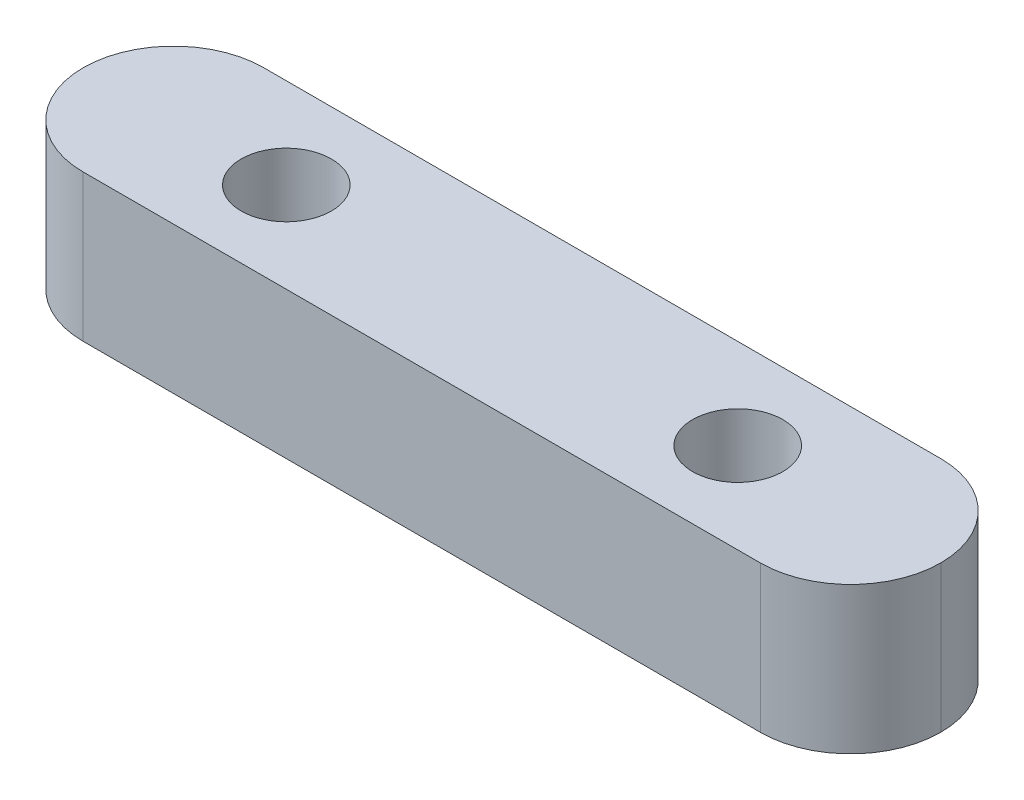
ISO-10303-21;
HEADER;
FILE_DESCRIPTION(('STEP AP214'),'2;1');
FILE_NAME('part.step','',(''),(''),'','','');
FILE_SCHEMA(('AUTOMOTIVE_DESIGN { 1 0 10303 214 1 1 1 1 }'));
ENDSEC;
DATA;
#1=APPLICATION_CONTEXT('core data for automotive mechanical design processes');
#2=APPLICATION_PROTOCOL_DEFINITION('international standard','automotive_design',2000,#1);
#3=PRODUCT_CONTEXT('',#1,'mechanical');
#4=PRODUCT('Part','Part','',(#3));
#5=PRODUCT_RELATED_PRODUCT_CATEGORY('part','',(#4));
#6=PRODUCT_DEFINITION_FORMATION('','',#4);
#7=PRODUCT_DEFINITION_CONTEXT('part definition',#1,'design');
#8=PRODUCT_DEFINITION('design','',#6,#7);
#9=PRODUCT_DEFINITION_SHAPE('','',#8);
#10=(LENGTH_UNIT() NAMED_UNIT(*) SI_UNIT(.MILLI.,.METRE.));
#11=(NAMED_UNIT(*) PLANE_ANGLE_UNIT() SI_UNIT($,.RADIAN.));
#12=(NAMED_UNIT(*) SI_UNIT($,.STERADIAN.) SOLID_ANGLE_UNIT());
#13=UNCERTAINTY_MEASURE_WITH_UNIT(LENGTH_MEASURE(1.E-05),#10,'distance_accuracy_value','');
#14=(GEOMETRIC_REPRESENTATION_CONTEXT(3) GLOBAL_UNCERTAINTY_ASSIGNED_CONTEXT((#13)) GLOBAL_UNIT_ASSIGNED_CONTEXT((#10,
#11,#12)) REPRESENTATION_CONTEXT('',''));
#15=CARTESIAN_POINT('',(0.,0.,0.));
#16=DIRECTION('',(0.,0.,1.));
#17=DIRECTION('',(1.,0.,0.));
#18=AXIS2_PLACEMENT_3D('',#15,#16,#17);
#19=CARTESIAN_POINT('',(0.,3.25,0.));
#20=DIRECTION('',(0.,-1.,0.));
#21=DIRECTION('',(0.,0.,-1.));
#22=AXIS2_PLACEMENT_3D('',#19,#20,#21);
#23=PLANE('',#22);
#24=CARTESIAN_POINT('',(-15.,3.25,0.));
#25=DIRECTION('',(0.,-1.,0.));
#26=DIRECTION('',(0.,0.,-1.));
#27=AXIS2_PLACEMENT_3D('',#24,#25,#26);
#28=CIRCLE('',#27,4.);
#29=CARTESIAN_POINT('',(-15.,3.25,-4.));
#30=VERTEX_POINT('',#29);
#31=CARTESIAN_POINT('',(-19.,3.25,0.));
#32=VERTEX_POINT('',#31);
#33=EDGE_CURVE('E59',#30,#32,#28,.F.);
#34=ORIENTED_EDGE('',*,*,#33,.T.);
#35=CARTESIAN_POINT('',(-15.,3.25,0.));
#36=DIRECTION('',(0.,-1.,0.));
#37=DIRECTION('',(0.,0.,-1.));
#38=AXIS2_PLACEMENT_3D('',#35,#36,#37);
#39=CIRCLE('',#38,4.);
#40=CARTESIAN_POINT('',(-15.,3.25,4.));
#41=VERTEX_POINT('',#40);
#42=EDGE_CURVE('E140',#32,#41,#39,.F.);
#43=ORIENTED_EDGE('',*,*,#42,.T.);
#44=DIRECTION('',(1.,0.,0.));
#45=VECTOR('',#44,1.);
#46=CARTESIAN_POINT('',(-19.,3.25,4.));
#47=LINE('',#46,#45);
#48=CARTESIAN_POINT('',(15.,3.25,4.));
#49=VERTEX_POINT('',#48);
#50=EDGE_CURVE('E113',#41,#49,#47,.T.);
#51=ORIENTED_EDGE('',*,*,#50,.T.);
#52=CARTESIAN_POINT('',(15.,3.25,0.));
#53=DIRECTION('',(0.,-1.,0.));
#54=DIRECTION('',(0.,0.,-1.));
#55=AXIS2_PLACEMENT_3D('',#52,#53,#54);
#56=CIRCLE('',#55,4.);
#57=CARTESIAN_POINT('',(19.,3.25,0.));
#58=VERTEX_POINT('',#57);
#59=EDGE_CURVE('E104',#49,#58,#56,.F.);
#60=ORIENTED_EDGE('',*,*,#59,.T.);
#61=CARTESIAN_POINT('',(15.,3.25,0.));
#62=DIRECTION('',(0.,-1.,0.));
#63=DIRECTION('',(0.,0.,-1.));
#64=AXIS2_PLACEMENT_3D('',#61,#62,#63);
#65=CIRCLE('',#64,4.);
#66=CARTESIAN_POINT('',(15.,3.25,-4.));
#67=VERTEX_POINT('',#66);
#68=EDGE_CURVE('E138',#58,#67,#65,.F.);
#69=ORIENTED_EDGE('',*,*,#68,.T.);
#70=DIRECTION('',(-1.,0.,0.));
#71=VECTOR('',#70,1.);
#72=CARTESIAN_POINT('',(-19.,3.25,-4.));
#73=LINE('',#72,#71);
#74=EDGE_CURVE('E125',#67,#30,#73,.T.);
#75=ORIENTED_EDGE('',*,*,#74,.T.);
#76=EDGE_LOOP('',(#34,#43,#51,#60,#69,#75));
#77=FACE_BOUND('',#76,.T.);
#78=CARTESIAN_POINT('',(-10.,3.25,0.));
#79=DIRECTION('',(0.,1.,0.));
#80=DIRECTION('',(0.,0.,1.));
#81=AXIS2_PLACEMENT_3D('',#78,#79,#80);
#82=CIRCLE('',#81,2.);
#83=CARTESIAN_POINT('',(-10.,3.25,-2.));
#84=VERTEX_POINT('',#83);
#85=EDGE_CURVE('E127',#84,#84,#82,.T.);
#86=ORIENTED_EDGE('',*,*,#85,.F.);
#87=EDGE_LOOP('',(#86));
#88=FACE_BOUND('',#87,.T.);
#89=CARTESIAN_POINT('',(10.,3.25,0.));
#90=DIRECTION('',(0.,1.,0.));
#91=DIRECTION('',(0.,0.,-1.));
#92=AXIS2_PLACEMENT_3D('',#89,#90,#91);
#93=CIRCLE('',#92,2.);
#94=CARTESIAN_POINT('',(10.,3.25,-2.));
#95=VERTEX_POINT('',#94);
#96=EDGE_CURVE('E145',#95,#95,#93,.T.);
#97=ORIENTED_EDGE('',*,*,#96,.F.);
#98=EDGE_LOOP('',(#97));
#99=FACE_BOUND('',#98,.T.);
#100=ADVANCED_FACE('F41',(#77,#88,#99),#23,.F.);
#101=CARTESIAN_POINT('',(0.,-3.25,0.));
#102=DIRECTION('',(0.,-1.,0.));
#103=DIRECTION('',(0.,0.,-1.));
#104=AXIS2_PLACEMENT_3D('',#101,#102,#103);
#105=PLANE('',#104);
#106=CARTESIAN_POINT('',(-10.,-3.25,0.));
#107=DIRECTION('',(0.,1.,0.));
#108=DIRECTION('',(0.,0.,1.));
#109=AXIS2_PLACEMENT_3D('',#106,#107,#108);
#110=CIRCLE('',#109,2.);
#111=CARTESIAN_POINT('',(-10.,-3.25,-2.));
#112=VERTEX_POINT('',#111);
#113=EDGE_CURVE('E156',#112,#112,#110,.T.);
#114=ORIENTED_EDGE('',*,*,#113,.T.);
#115=EDGE_LOOP('',(#114));
#116=FACE_BOUND('',#115,.T.);
#117=DIRECTION('',(1.,0.,0.));
#118=VECTOR('',#117,1.);
#119=CARTESIAN_POINT('',(-19.,-3.25,4.));
#120=LINE('',#119,#118);
#121=CARTESIAN_POINT('',(-15.,-3.25,4.));
#122=VERTEX_POINT('',#121);
#123=CARTESIAN_POINT('',(15.,-3.25,4.));
#124=VERTEX_POINT('',#123);
#125=EDGE_CURVE('E115',#122,#124,#120,.T.);
#126=ORIENTED_EDGE('',*,*,#125,.F.);
#127=CARTESIAN_POINT('',(-15.,-3.25,0.));
#128=DIRECTION('',(0.,-1.,0.));
#129=DIRECTION('',(0.,0.,-1.));
#130=AXIS2_PLACEMENT_3D('',#127,#128,#129);
#131=CIRCLE('',#130,4.);
#132=CARTESIAN_POINT('',(-19.,-3.25,0.));
#133=VERTEX_POINT('',#132);
#134=EDGE_CURVE('E96',#122,#133,#131,.T.);
#135=ORIENTED_EDGE('',*,*,#134,.T.);
#136=CARTESIAN_POINT('',(-15.,-3.25,0.));
#137=DIRECTION('',(0.,-1.,0.));
#138=DIRECTION('',(0.,0.,-1.));
#139=AXIS2_PLACEMENT_3D('',#136,#137,#138);
#140=CIRCLE('',#139,4.);
#141=CARTESIAN_POINT('',(-15.,-3.25,-4.));
#142=VERTEX_POINT('',#141);
#143=EDGE_CURVE('E106',#133,#142,#140,.T.);
#144=ORIENTED_EDGE('',*,*,#143,.T.);
#145=DIRECTION('',(-1.,0.,0.));
#146=VECTOR('',#145,1.);
#147=CARTESIAN_POINT('',(-19.,-3.25,-4.));
#148=LINE('',#147,#146);
#149=CARTESIAN_POINT('',(15.,-3.25,-4.));
#150=VERTEX_POINT('',#149);
#151=EDGE_CURVE('E123',#150,#142,#148,.T.);
#152=ORIENTED_EDGE('',*,*,#151,.F.);
#153=CARTESIAN_POINT('',(15.,-3.25,0.));
#154=DIRECTION('',(0.,-1.,0.));
#155=DIRECTION('',(0.,0.,-1.));
#156=AXIS2_PLACEMENT_3D('',#153,#154,#155);
#157=CIRCLE('',#156,4.);
#158=CARTESIAN_POINT('',(19.,-3.25,0.));
#159=VERTEX_POINT('',#158);
#160=EDGE_CURVE('E131',#150,#159,#157,.T.);
#161=ORIENTED_EDGE('',*,*,#160,.T.);
#162=CARTESIAN_POINT('',(15.,-3.25,0.));
#163=DIRECTION('',(0.,-1.,0.));
#164=DIRECTION('',(0.,0.,-1.));
#165=AXIS2_PLACEMENT_3D('',#162,#163,#164);
#166=CIRCLE('',#165,4.);
#167=EDGE_CURVE('E119',#159,#124,#166,.T.);
#168=ORIENTED_EDGE('',*,*,#167,.T.);
#169=EDGE_LOOP('',(#126,#135,#144,#152,#161,#168));
#170=FACE_BOUND('',#169,.T.);
#171=CARTESIAN_POINT('',(10.,-3.25,0.));
#172=DIRECTION('',(0.,1.,0.));
#173=DIRECTION('',(0.,0.,-1.));
#174=AXIS2_PLACEMENT_3D('',#171,#172,#173);
#175=CIRCLE('',#174,2.);
#176=CARTESIAN_POINT('',(10.,-3.25,-2.));
#177=VERTEX_POINT('',#176);
#178=EDGE_CURVE('E142',#177,#177,#175,.T.);
#179=ORIENTED_EDGE('',*,*,#178,.T.);
#180=EDGE_LOOP('',(#179));
#181=FACE_BOUND('',#180,.T.);
#182=ADVANCED_FACE('F118',(#116,#170,#181),#105,.T.);
#183=CARTESIAN_POINT('',(-19.,3.25,-4.));
#184=DIRECTION('',(0.,0.,1.));
#185=DIRECTION('',(1.,0.,0.));
#186=AXIS2_PLACEMENT_3D('',#183,#184,#185);
#187=PLANE('',#186);
#188=ORIENTED_EDGE('',*,*,#151,.T.);
#189=DIRECTION('',(0.,-1.,0.));
#190=VECTOR('',#189,1.);
#191=CARTESIAN_POINT('',(-15.,3.25,-4.));
#192=LINE('',#191,#190);
#193=EDGE_CURVE('E11',#142,#30,#192,.F.);
#194=ORIENTED_EDGE('',*,*,#193,.T.);
#195=ORIENTED_EDGE('',*,*,#74,.F.);
#196=DIRECTION('',(0.,-1.,0.));
#197=VECTOR('',#196,1.);
#198=CARTESIAN_POINT('',(15.,3.25,-4.));
#199=LINE('',#198,#197);
#200=EDGE_CURVE('E49',#67,#150,#199,.T.);
#201=ORIENTED_EDGE('',*,*,#200,.T.);
#202=EDGE_LOOP('',(#188,#194,#195,#201));
#203=FACE_BOUND('',#202,.T.);
#204=ADVANCED_FACE('F175',(#203),#187,.F.);
#205=CARTESIAN_POINT('',(-19.,3.25,4.));
#206=DIRECTION('',(0.,0.,-1.));
#207=DIRECTION('',(-1.,0.,0.));
#208=AXIS2_PLACEMENT_3D('',#205,#206,#207);
#209=PLANE('',#208);
#210=ORIENTED_EDGE('',*,*,#50,.F.);
#211=DIRECTION('',(0.,-1.,0.));
#212=VECTOR('',#211,1.);
#213=CARTESIAN_POINT('',(-15.,3.25,4.));
#214=LINE('',#213,#212);
#215=EDGE_CURVE('E99',#41,#122,#214,.T.);
#216=ORIENTED_EDGE('',*,*,#215,.T.);
#217=ORIENTED_EDGE('',*,*,#125,.T.);
#218=DIRECTION('',(0.,-1.,0.));
#219=VECTOR('',#218,1.);
#220=CARTESIAN_POINT('',(15.,3.25,4.));
#221=LINE('',#220,#219);
#222=EDGE_CURVE('E116',#124,#49,#221,.F.);
#223=ORIENTED_EDGE('',*,*,#222,.T.);
#224=EDGE_LOOP('',(#210,#216,#217,#223));
#225=FACE_BOUND('',#224,.T.);
#226=ADVANCED_FACE('F112',(#225),#209,.F.);
#227=CARTESIAN_POINT('',(-10.,3.25,0.));
#228=DIRECTION('',(0.,-1.,0.));
#229=DIRECTION('',(0.,0.,-1.));
#230=AXIS2_PLACEMENT_3D('',#227,#228,#229);
#231=CYLINDRICAL_SURFACE('',#230,2.);
#232=CARTESIAN_POINT('',(-10.,3.25,-2.));
#233=CARTESIAN_POINT('',(-10.,3.18229166666667,-2.));
#234=CARTESIAN_POINT('',(-10.,3.11458333333333,-2.));
#235=CARTESIAN_POINT('',(-10.,2.97916666666667,-2.));
#236=CARTESIAN_POINT('',(-10.,2.91145833333333,-2.));
#237=CARTESIAN_POINT('',(-10.,2.77604166666667,-2.));
#238=CARTESIAN_POINT('',(-10.,2.70833333333333,-2.));
#239=CARTESIAN_POINT('',(-10.,2.57291666666667,-2.));
#240=CARTESIAN_POINT('',(-10.,2.50520833333333,-2.));
#241=CARTESIAN_POINT('',(-10.,2.36979166666667,-2.));
#242=CARTESIAN_POINT('',(-10.,2.30208333333333,-2.));
#243=CARTESIAN_POINT('',(-10.,2.16666666666667,-2.));
#244=CARTESIAN_POINT('',(-10.,2.09895833333333,-2.));
#245=CARTESIAN_POINT('',(-10.,1.96354166666667,-2.));
#246=CARTESIAN_POINT('',(-10.,1.89583333333333,-2.));
#247=CARTESIAN_POINT('',(-10.,1.76041666666667,-2.));
#248=CARTESIAN_POINT('',(-10.,1.69270833333333,-2.));
#249=CARTESIAN_POINT('',(-10.,1.55729166666667,-2.));
#250=CARTESIAN_POINT('',(-10.,1.48958333333333,-2.));
#251=CARTESIAN_POINT('',(-10.,1.35416666666667,-2.));
#252=CARTESIAN_POINT('',(-10.,1.28645833333333,-2.));
#253=CARTESIAN_POINT('',(-10.,1.15104166666667,-2.));
#254=CARTESIAN_POINT('',(-10.,1.08333333333333,-2.));
#255=CARTESIAN_POINT('',(-10.,0.947916666666666,-2.));
#256=CARTESIAN_POINT('',(-10.,0.880208333333333,-2.));
#257=CARTESIAN_POINT('',(-10.,0.744791666666666,-2.));
#258=CARTESIAN_POINT('',(-10.,0.677083333333333,-2.));
#259=CARTESIAN_POINT('',(-10.,0.541666666666666,-2.));
#260=CARTESIAN_POINT('',(-10.,0.473958333333333,-2.));
#261=CARTESIAN_POINT('',(-10.,0.338541666666666,-2.));
#262=CARTESIAN_POINT('',(-10.,0.270833333333333,-2.));
#263=CARTESIAN_POINT('',(-10.,0.135416666666666,-2.));
#264=CARTESIAN_POINT('',(-10.,0.0677083333333329,-2.));
#265=CARTESIAN_POINT('',(-10.,-0.0677083333333338,-2.));
#266=CARTESIAN_POINT('',(-10.,-0.135416666666667,-2.));
#267=CARTESIAN_POINT('',(-10.,-0.270833333333334,-2.));
#268=CARTESIAN_POINT('',(-10.,-0.338541666666667,-2.));
#269=CARTESIAN_POINT('',(-10.,-0.473958333333334,-2.));
#270=CARTESIAN_POINT('',(-10.,-0.541666666666667,-2.));
#271=CARTESIAN_POINT('',(-10.,-0.677083333333333,-2.));
#272=CARTESIAN_POINT('',(-10.,-0.744791666666667,-2.));
#273=CARTESIAN_POINT('',(-10.,-0.880208333333333,-2.));
#274=CARTESIAN_POINT('',(-10.,-0.947916666666666,-2.));
#275=CARTESIAN_POINT('',(-10.,-1.08333333333333,-2.));
#276=CARTESIAN_POINT('',(-10.,-1.15104166666667,-2.));
#277=CARTESIAN_POINT('',(-10.,-1.28645833333333,-2.));
#278=CARTESIAN_POINT('',(-10.,-1.35416666666667,-2.));
#279=CARTESIAN_POINT('',(-10.,-1.48958333333333,-2.));
#280=CARTESIAN_POINT('',(-10.,-1.55729166666667,-2.));
#281=CARTESIAN_POINT('',(-10.,-1.69270833333333,-2.));
#282=CARTESIAN_POINT('',(-10.,-1.76041666666667,-2.));
#283=CARTESIAN_POINT('',(-10.,-1.89583333333333,-2.));
#284=CARTESIAN_POINT('',(-10.,-1.96354166666667,-2.));
#285=CARTESIAN_POINT('',(-10.,-2.09895833333333,-2.));
#286=CARTESIAN_POINT('',(-10.,-2.16666666666667,-2.));
#287=CARTESIAN_POINT('',(-10.,-2.30208333333333,-2.));
#288=CARTESIAN_POINT('',(-10.,-2.36979166666667,-2.));
#289=CARTESIAN_POINT('',(-10.,-2.50520833333333,-2.));
#290=CARTESIAN_POINT('',(-10.,-2.57291666666667,-2.));
#291=CARTESIAN_POINT('',(-10.,-2.70833333333333,-2.));
#292=CARTESIAN_POINT('',(-10.,-2.77604166666667,-2.));
#293=CARTESIAN_POINT('',(-10.,-2.91145833333333,-2.));
#294=CARTESIAN_POINT('',(-10.,-2.97916666666667,-2.));
#295=CARTESIAN_POINT('',(-10.,-3.11458333333333,-2.));
#296=CARTESIAN_POINT('',(-10.,-3.18229166666667,-2.));
#297=CARTESIAN_POINT('',(-10.,-3.25,-2.));
#298=B_SPLINE_CURVE_WITH_KNOTS('',3,(#232,#233,#234,#235,#236,#237,#238,#239,#240,#241,#242,
#243,#244,#245,#246,#247,#248,#249,#250,#251,#252,#253,#254,#255,#256,#257,#258,#259,#260,#261,
#262,#263,#264,#265,#266,#267,#268,#269,#270,#271,#272,#273,#274,#275,#276,#277,#278,#279,#280,
#281,#282,#283,#284,#285,#286,#287,#288,#289,#290,#291,#292,#293,#294,#295,#296,#297),
.UNSPECIFIED.,.F.,.F.,(4,2,2,2,2,2,2,2,2,2,2,2,2,2,2,2,2,2,2,2,2,2,2,2,2,2,2,2,2,2,2,2,4),(0.,
0.203125,0.40625,0.609375,0.8125,1.015625,1.21875,1.421875,1.625,1.828125,2.03125,2.234375,
2.4375,2.640625,2.84375,3.046875,3.25,3.453125,3.65625,3.859375,4.0625,4.265625,4.46875,
4.671875,4.875,5.078125,5.28125,5.484375,5.6875,5.890625,6.09375,6.296875,6.5),.UNSPECIFIED.);
#299=EDGE_CURVE('BSEAM180',#84,#112,#298,.T.);
#300=ORIENTED_EDGE('',*,*,#85,.T.);
#301=ORIENTED_EDGE('',*,*,#113,.F.);
#302=ORIENTED_EDGE('',*,*,#299,.T.);
#303=ORIENTED_EDGE('',*,*,#299,.F.);
#304=EDGE_LOOP('',(#300,#302,#301,#303));
#305=FACE_BOUND('',#304,.T.);
#306=ADVANCED_FACE('F180',(#305),#231,.F.);
#307=CARTESIAN_POINT('',(10.,3.25,0.));
#308=DIRECTION('',(0.,-1.,0.));
#309=DIRECTION('',(0.,0.,-1.));
#310=AXIS2_PLACEMENT_3D('',#307,#308,#309);
#311=CYLINDRICAL_SURFACE('',#310,2.);
#312=CARTESIAN_POINT('',(10.,3.25,-2.));
#313=CARTESIAN_POINT('',(10.,3.18229166666667,-2.));
#314=CARTESIAN_POINT('',(10.,3.11458333333333,-2.));
#315=CARTESIAN_POINT('',(10.,2.97916666666667,-2.));
#316=CARTESIAN_POINT('',(10.,2.91145833333333,-2.));
#317=CARTESIAN_POINT('',(10.,2.77604166666667,-2.));
#318=CARTESIAN_POINT('',(10.,2.70833333333333,-2.));
#319=CARTESIAN_POINT('',(10.,2.57291666666667,-2.));
#320=CARTESIAN_POINT('',(10.,2.50520833333333,-2.));
#321=CARTESIAN_POINT('',(10.,2.36979166666667,-2.));
#322=CARTESIAN_POINT('',(10.,2.30208333333333,-2.));
#323=CARTESIAN_POINT('',(10.,2.16666666666667,-2.));
#324=CARTESIAN_POINT('',(10.,2.09895833333333,-2.));
#325=CARTESIAN_POINT('',(10.,1.96354166666667,-2.));
#326=CARTESIAN_POINT('',(10.,1.89583333333333,-2.));
#327=CARTESIAN_POINT('',(10.,1.76041666666667,-2.));
#328=CARTESIAN_POINT('',(10.,1.69270833333333,-2.));
#329=CARTESIAN_POINT('',(10.,1.55729166666667,-2.));
#330=CARTESIAN_POINT('',(10.,1.48958333333333,-2.));
#331=CARTESIAN_POINT('',(10.,1.35416666666667,-2.));
#332=CARTESIAN_POINT('',(10.,1.28645833333333,-2.));
#333=CARTESIAN_POINT('',(10.,1.15104166666667,-2.));
#334=CARTESIAN_POINT('',(10.,1.08333333333333,-2.));
#335=CARTESIAN_POINT('',(10.,0.947916666666666,-2.));
#336=CARTESIAN_POINT('',(10.,0.880208333333333,-2.));
#337=CARTESIAN_POINT('',(10.,0.744791666666666,-2.));
#338=CARTESIAN_POINT('',(10.,0.677083333333333,-2.));
#339=CARTESIAN_POINT('',(10.,0.541666666666666,-2.));
#340=CARTESIAN_POINT('',(10.,0.473958333333333,-2.));
#341=CARTESIAN_POINT('',(10.,0.338541666666666,-2.));
#342=CARTESIAN_POINT('',(10.,0.270833333333333,-2.));
#343=CARTESIAN_POINT('',(10.,0.135416666666666,-2.));
#344=CARTESIAN_POINT('',(10.,0.0677083333333329,-2.));
#345=CARTESIAN_POINT('',(10.,-0.0677083333333338,-2.));
#346=CARTESIAN_POINT('',(10.,-0.135416666666667,-2.));
#347=CARTESIAN_POINT('',(10.,-0.270833333333334,-2.));
#348=CARTESIAN_POINT('',(10.,-0.338541666666667,-2.));
#349=CARTESIAN_POINT('',(10.,-0.473958333333334,-2.));
#350=CARTESIAN_POINT('',(10.,-0.541666666666667,-2.));
#351=CARTESIAN_POINT('',(10.,-0.677083333333333,-2.));
#352=CARTESIAN_POINT('',(10.,-0.744791666666667,-2.));
#353=CARTESIAN_POINT('',(10.,-0.880208333333333,-2.));
#354=CARTESIAN_POINT('',(10.,-0.947916666666666,-2.));
#355=CARTESIAN_POINT('',(10.,-1.08333333333333,-2.));
#356=CARTESIAN_POINT('',(10.,-1.15104166666667,-2.));
#357=CARTESIAN_POINT('',(10.,-1.28645833333333,-2.));
#358=CARTESIAN_POINT('',(10.,-1.35416666666667,-2.));
#359=CARTESIAN_POINT('',(10.,-1.48958333333333,-2.));
#360=CARTESIAN_POINT('',(10.,-1.55729166666667,-2.));
#361=CARTESIAN_POINT('',(10.,-1.69270833333333,-2.));
#362=CARTESIAN_POINT('',(10.,-1.76041666666667,-2.));
#363=CARTESIAN_POINT('',(10.,-1.89583333333333,-2.));
#364=CARTESIAN_POINT('',(10.,-1.96354166666667,-2.));
#365=CARTESIAN_POINT('',(10.,-2.09895833333333,-2.));
#366=CARTESIAN_POINT('',(10.,-2.16666666666667,-2.));
#367=CARTESIAN_POINT('',(10.,-2.30208333333333,-2.));
#368=CARTESIAN_POINT('',(10.,-2.36979166666667,-2.));
#369=CARTESIAN_POINT('',(10.,-2.50520833333333,-2.));
#370=CARTESIAN_POINT('',(10.,-2.57291666666667,-2.));
#371=CARTESIAN_POINT('',(10.,-2.70833333333333,-2.));
#372=CARTESIAN_POINT('',(10.,-2.77604166666667,-2.));
#373=CARTESIAN_POINT('',(10.,-2.91145833333333,-2.));
#374=CARTESIAN_POINT('',(10.,-2.97916666666667,-2.));
#375=CARTESIAN_POINT('',(10.,-3.11458333333333,-2.));
#376=CARTESIAN_POINT('',(10.,-3.18229166666667,-2.));
#377=CARTESIAN_POINT('',(10.,-3.25,-2.));
#378=B_SPLINE_CURVE_WITH_KNOTS('',3,(#312,#313,#314,#315,#316,#317,#318,#319,#320,#321,#322,
#323,#324,#325,#326,#327,#328,#329,#330,#331,#332,#333,#334,#335,#336,#337,#338,#339,#340,#341,
#342,#343,#344,#345,#346,#347,#348,#349,#350,#351,#352,#353,#354,#355,#356,#357,#358,#359,#360,
#361,#362,#363,#364,#365,#366,#367,#368,#369,#370,#371,#372,#373,#374,#375,#376,#377),
.UNSPECIFIED.,.F.,.F.,(4,2,2,2,2,2,2,2,2,2,2,2,2,2,2,2,2,2,2,2,2,2,2,2,2,2,2,2,2,2,2,2,4),(0.,
0.203125,0.40625,0.609375,0.8125,1.015625,1.21875,1.421875,1.625,1.828125,2.03125,2.234375,
2.4375,2.640625,2.84375,3.046875,3.25,3.453125,3.65625,3.859375,4.0625,4.265625,4.46875,
4.671875,4.875,5.078125,5.28125,5.484375,5.6875,5.890625,6.09375,6.296875,6.5),.UNSPECIFIED.);
#379=EDGE_CURVE('BSEAM163',#95,#177,#378,.T.);
#380=ORIENTED_EDGE('',*,*,#96,.T.);
#381=ORIENTED_EDGE('',*,*,#178,.F.);
#382=ORIENTED_EDGE('',*,*,#379,.T.);
#383=ORIENTED_EDGE('',*,*,#379,.F.);
#384=EDGE_LOOP('',(#380,#382,#381,#383));
#385=FACE_BOUND('',#384,.T.);
#386=ADVANCED_FACE('F163',(#385),#311,.F.);
#387=CARTESIAN_POINT('',(-15.,3.25,0.));
#388=DIRECTION('',(0.,-1.,0.));
#389=DIRECTION('',(0.,0.,-1.));
#390=AXIS2_PLACEMENT_3D('',#387,#388,#389);
#391=CYLINDRICAL_SURFACE('',#390,4.);
#392=DIRECTION('',(0.,-1.,0.));
#393=VECTOR('',#392,1.);
#394=CARTESIAN_POINT('',(-19.,3.25,0.));
#395=LINE('',#394,#393);
#396=EDGE_CURVE('E101',#32,#133,#395,.T.);
#397=ORIENTED_EDGE('',*,*,#396,.F.);
#398=ORIENTED_EDGE('',*,*,#33,.F.);
#399=ORIENTED_EDGE('',*,*,#193,.F.);
#400=ORIENTED_EDGE('',*,*,#143,.F.);
#401=EDGE_LOOP('',(#397,#398,#399,#400));
#402=FACE_BOUND('',#401,.T.);
#403=ADVANCED_FACE('F189',(#402),#391,.T.);
#404=CARTESIAN_POINT('',(-15.,3.25,0.));
#405=DIRECTION('',(0.,-1.,0.));
#406=DIRECTION('',(0.,0.,-1.));
#407=AXIS2_PLACEMENT_3D('',#404,#405,#406);
#408=CYLINDRICAL_SURFACE('',#407,4.);
#409=ORIENTED_EDGE('',*,*,#42,.F.);
#410=ORIENTED_EDGE('',*,*,#396,.T.);
#411=ORIENTED_EDGE('',*,*,#134,.F.);
#412=ORIENTED_EDGE('',*,*,#215,.F.);
#413=EDGE_LOOP('',(#409,#410,#411,#412));
#414=FACE_BOUND('',#413,.T.);
#415=ADVANCED_FACE('F97',(#414),#408,.T.);
#416=CARTESIAN_POINT('',(15.,3.25,0.));
#417=DIRECTION('',(0.,-1.,0.));
#418=DIRECTION('',(0.,0.,-1.));
#419=AXIS2_PLACEMENT_3D('',#416,#417,#418);
#420=CYLINDRICAL_SURFACE('',#419,4.);
#421=DIRECTION('',(0.,-1.,0.));
#422=VECTOR('',#421,1.);
#423=CARTESIAN_POINT('',(19.,3.25,0.));
#424=LINE('',#423,#422);
#425=EDGE_CURVE('E44',#58,#159,#424,.T.);
#426=ORIENTED_EDGE('',*,*,#425,.F.);
#427=ORIENTED_EDGE('',*,*,#59,.F.);
#428=ORIENTED_EDGE('',*,*,#222,.F.);
#429=ORIENTED_EDGE('',*,*,#167,.F.);
#430=EDGE_LOOP('',(#426,#427,#428,#429));
#431=FACE_BOUND('',#430,.T.);
#432=ADVANCED_FACE('F43',(#431),#420,.T.);
#433=CARTESIAN_POINT('',(15.,3.25,0.));
#434=DIRECTION('',(0.,-1.,0.));
#435=DIRECTION('',(0.,0.,-1.));
#436=AXIS2_PLACEMENT_3D('',#433,#434,#435);
#437=CYLINDRICAL_SURFACE('',#436,4.);
#438=ORIENTED_EDGE('',*,*,#68,.F.);
#439=ORIENTED_EDGE('',*,*,#425,.T.);
#440=ORIENTED_EDGE('',*,*,#160,.F.);
#441=ORIENTED_EDGE('',*,*,#200,.F.);
#442=EDGE_LOOP('',(#438,#439,#440,#441));
#443=FACE_BOUND('',#442,.T.);
#444=ADVANCED_FACE('F147',(#443),#437,.T.);
#445=CLOSED_SHELL('',(#100,#182,#204,#226,#306,#386,#403,#415,#432,#444));
#446=MANIFOLD_SOLID_BREP('B2',#445);
#447=ADVANCED_BREP_SHAPE_REPRESENTATION('',(#18,#446),#14);
#448=SHAPE_DEFINITION_REPRESENTATION(#9,#447);
ENDSEC;
END-ISO-10303-21;
